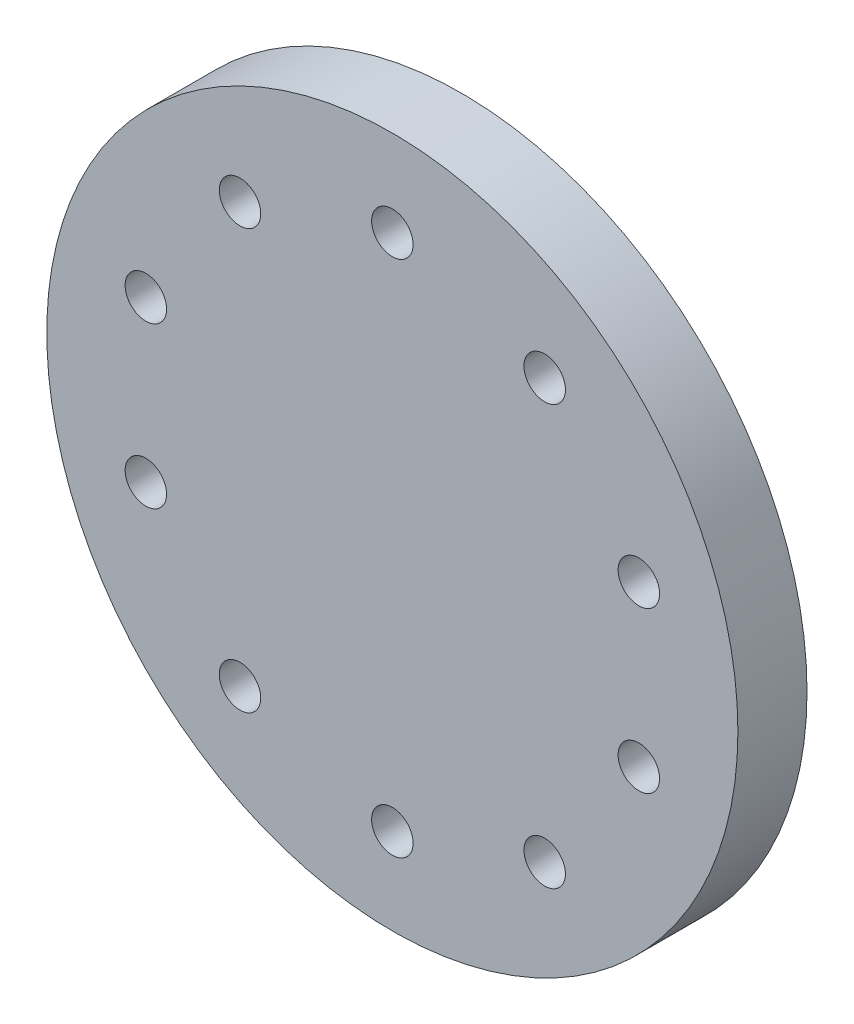
ISO-10303-21;
HEADER;
FILE_DESCRIPTION(('STEP AP214'),'2;1');
FILE_NAME('part.step','',(''),(''),'','','');
FILE_SCHEMA(('AUTOMOTIVE_DESIGN { 1 0 10303 214 1 1 1 1 }'));
ENDSEC;
DATA;
#1=APPLICATION_CONTEXT('core data for automotive mechanical design processes');
#2=APPLICATION_PROTOCOL_DEFINITION('international standard','automotive_design',2000,#1);
#3=PRODUCT_CONTEXT('',#1,'mechanical');
#4=PRODUCT('Part','Part','',(#3));
#5=PRODUCT_RELATED_PRODUCT_CATEGORY('part','',(#4));
#6=PRODUCT_DEFINITION_FORMATION('','',#4);
#7=PRODUCT_DEFINITION_CONTEXT('part definition',#1,'design');
#8=PRODUCT_DEFINITION('design','',#6,#7);
#9=PRODUCT_DEFINITION_SHAPE('','',#8);
#10=(LENGTH_UNIT() NAMED_UNIT(*) SI_UNIT(.MILLI.,.METRE.));
#11=(NAMED_UNIT(*) PLANE_ANGLE_UNIT() SI_UNIT($,.RADIAN.));
#12=(NAMED_UNIT(*) SI_UNIT($,.STERADIAN.) SOLID_ANGLE_UNIT());
#13=UNCERTAINTY_MEASURE_WITH_UNIT(LENGTH_MEASURE(1.E-05),#10,'distance_accuracy_value','');
#14=(GEOMETRIC_REPRESENTATION_CONTEXT(3) GLOBAL_UNCERTAINTY_ASSIGNED_CONTEXT((#13)) GLOBAL_UNIT_ASSIGNED_CONTEXT((#10,
#11,#12)) REPRESENTATION_CONTEXT('',''));
#15=CARTESIAN_POINT('',(0.,0.,0.));
#16=DIRECTION('',(0.,0.,1.));
#17=DIRECTION('',(1.,0.,0.));
#18=AXIS2_PLACEMENT_3D('',#15,#16,#17);
#19=CARTESIAN_POINT('',(0.,0.,2.));
#20=DIRECTION('',(0.,0.,1.));
#21=DIRECTION('',(1.,0.,0.));
#22=AXIS2_PLACEMENT_3D('',#19,#20,#21);
#23=PLANE('',#22);
#24=CARTESIAN_POINT('',(-7.13292387221344,2.3176274578118,2.));
#25=DIRECTION('',(0.,0.,1.));
#26=DIRECTION('',(1.,0.,0.));
#27=AXIS2_PLACEMENT_3D('',#24,#25,#26);
#28=CIRCLE('',#27,0.600000000000381);
#29=CARTESIAN_POINT('',(-6.53292387221306,2.3176274578118,2.));
#30=VERTEX_POINT('',#29);
#31=EDGE_CURVE('E94',#30,#30,#28,.T.);
#32=ORIENTED_EDGE('',*,*,#31,.F.);
#33=EDGE_LOOP('',(#32));
#34=FACE_BOUND('',#33,.T.);
#35=CARTESIAN_POINT('',(-4.40838939219298,-6.0676274578123,2.));
#36=DIRECTION('',(0.,0.,1.));
#37=DIRECTION('',(1.,0.,0.));
#38=AXIS2_PLACEMENT_3D('',#35,#36,#37);
#39=CIRCLE('',#38,0.600000000000669);
#40=CARTESIAN_POINT('',(-3.80838939219231,-6.0676274578123,2.));
#41=VERTEX_POINT('',#40);
#42=EDGE_CURVE('E82',#41,#41,#39,.T.);
#43=ORIENTED_EDGE('',*,*,#42,.F.);
#44=EDGE_LOOP('',(#43));
#45=FACE_BOUND('',#44,.T.);
#46=CARTESIAN_POINT('',(4.40838939219413,-6.06762745781192,2.));
#47=DIRECTION('',(0.,0.,1.));
#48=DIRECTION('',(1.,0.,0.));
#49=AXIS2_PLACEMENT_3D('',#46,#47,#48);
#50=CIRCLE('',#49,0.600000000000539);
#51=CARTESIAN_POINT('',(5.00838939219467,-6.06762745781192,2.));
#52=VERTEX_POINT('',#51);
#53=EDGE_CURVE('E70',#52,#52,#50,.T.);
#54=ORIENTED_EDGE('',*,*,#53,.F.);
#55=EDGE_LOOP('',(#54));
#56=FACE_BOUND('',#55,.T.);
#57=CARTESIAN_POINT('',(7.13292387221388,2.31762745781241,2.));
#58=DIRECTION('',(0.,0.,1.));
#59=DIRECTION('',(1.,0.,0.));
#60=AXIS2_PLACEMENT_3D('',#57,#58,#59);
#61=CIRCLE('',#60,0.600000000000143);
#62=CARTESIAN_POINT('',(7.73292387221402,2.31762745781241,2.));
#63=VERTEX_POINT('',#62);
#64=EDGE_CURVE('E58',#63,#63,#61,.T.);
#65=ORIENTED_EDGE('',*,*,#64,.F.);
#66=EDGE_LOOP('',(#65));
#67=FACE_BOUND('',#66,.T.);
#68=CARTESIAN_POINT('',(0.,7.50000000000001,2.));
#69=DIRECTION('',(0.,0.,1.));
#70=DIRECTION('',(1.,0.,0.));
#71=AXIS2_PLACEMENT_3D('',#68,#69,#70);
#72=CIRCLE('',#71,0.6);
#73=CARTESIAN_POINT('',(0.6,7.50000000000001,2.));
#74=VERTEX_POINT('',#73);
#75=EDGE_CURVE('E47',#74,#74,#72,.T.);
#76=ORIENTED_EDGE('',*,*,#75,.F.);
#77=EDGE_LOOP('',(#76));
#78=FACE_BOUND('',#77,.T.);
#79=CARTESIAN_POINT('',(0.,0.,2.));
#80=DIRECTION('',(0.,0.,1.));
#81=DIRECTION('',(1.,0.,0.));
#82=AXIS2_PLACEMENT_3D('',#79,#80,#81);
#83=CIRCLE('',#82,10.);
#84=CARTESIAN_POINT('',(10.,0.,2.));
#85=VERTEX_POINT('',#84);
#86=EDGE_CURVE('E38',#85,#85,#83,.T.);
#87=ORIENTED_EDGE('',*,*,#86,.T.);
#88=EDGE_LOOP('',(#87));
#89=FACE_BOUND('',#88,.T.);
#90=CARTESIAN_POINT('',(4.40838939219356,6.06762745781211,2.));
#91=DIRECTION('',(0.,0.,1.));
#92=DIRECTION('',(1.,0.,0.));
#93=AXIS2_PLACEMENT_3D('',#90,#91,#92);
#94=CIRCLE('',#93,0.600000000000001);
#95=CARTESIAN_POINT('',(5.00838939219356,6.06762745781211,2.));
#96=VERTEX_POINT('',#95);
#97=EDGE_CURVE('E52',#96,#96,#94,.T.);
#98=ORIENTED_EDGE('',*,*,#97,.F.);
#99=EDGE_LOOP('',(#98));
#100=FACE_BOUND('',#99,.T.);
#101=CARTESIAN_POINT('',(7.13292387221408,-2.3176274578118,2.));
#102=DIRECTION('',(0.,0.,1.));
#103=DIRECTION('',(1.,0.,0.));
#104=AXIS2_PLACEMENT_3D('',#101,#102,#103);
#105=CIRCLE('',#104,0.600000000000342);
#106=CARTESIAN_POINT('',(7.73292387221442,-2.3176274578118,2.));
#107=VERTEX_POINT('',#106);
#108=EDGE_CURVE('E64',#107,#107,#105,.T.);
#109=ORIENTED_EDGE('',*,*,#108,.F.);
#110=EDGE_LOOP('',(#109));
#111=FACE_BOUND('',#110,.T.);
#112=CARTESIAN_POINT('',(6.3765149198537E-13,-7.50000000000001,2.));
#113=DIRECTION('',(0.,0.,1.));
#114=DIRECTION('',(1.,0.,0.));
#115=AXIS2_PLACEMENT_3D('',#112,#113,#114);
#116=CIRCLE('',#115,0.60000000000066);
#117=CARTESIAN_POINT('',(0.600000000001297,-7.50000000000001,2.));
#118=VERTEX_POINT('',#117);
#119=EDGE_CURVE('E76',#118,#118,#116,.T.);
#120=ORIENTED_EDGE('',*,*,#119,.F.);
#121=EDGE_LOOP('',(#120));
#122=FACE_BOUND('',#121,.T.);
#123=CARTESIAN_POINT('',(-7.13292387221324,-2.31762745781241,2.));
#124=DIRECTION('',(0.,0.,1.));
#125=DIRECTION('',(1.,0.,0.));
#126=AXIS2_PLACEMENT_3D('',#123,#124,#125);
#127=CIRCLE('',#126,0.600000000000556);
#128=CARTESIAN_POINT('',(-6.53292387221269,-2.31762745781241,2.));
#129=VERTEX_POINT('',#128);
#130=EDGE_CURVE('E88',#129,#129,#127,.T.);
#131=ORIENTED_EDGE('',*,*,#130,.F.);
#132=EDGE_LOOP('',(#131));
#133=FACE_BOUND('',#132,.T.);
#134=CARTESIAN_POINT('',(-4.40838939219349,6.06762745781192,2.));
#135=DIRECTION('',(0.,0.,1.));
#136=DIRECTION('',(1.,0.,0.));
#137=AXIS2_PLACEMENT_3D('',#134,#135,#136);
#138=CIRCLE('',#137,0.600000000000209);
#139=CARTESIAN_POINT('',(-3.80838939219329,6.06762745781192,2.));
#140=VERTEX_POINT('',#139);
#141=EDGE_CURVE('E100',#140,#140,#138,.T.);
#142=ORIENTED_EDGE('',*,*,#141,.F.);
#143=EDGE_LOOP('',(#142));
#144=FACE_BOUND('',#143,.T.);
#145=ADVANCED_FACE('F31',(#34,#45,#56,#67,#78,#89,#100,#111,#122,#133,#144),#23,.T.);
#146=CARTESIAN_POINT('',(0.,0.,0.));
#147=DIRECTION('',(0.,0.,1.));
#148=DIRECTION('',(1.,0.,0.));
#149=AXIS2_PLACEMENT_3D('',#146,#147,#148);
#150=PLANE('',#149);
#151=CARTESIAN_POINT('',(0.,0.,0.));
#152=DIRECTION('',(0.,0.,1.));
#153=DIRECTION('',(1.,0.,0.));
#154=AXIS2_PLACEMENT_3D('',#151,#152,#153);
#155=CIRCLE('',#154,1.5);
#156=CARTESIAN_POINT('',(1.5,0.,0.));
#157=VERTEX_POINT('',#156);
#158=EDGE_CURVE('E10',#157,#157,#155,.F.);
#159=ORIENTED_EDGE('',*,*,#158,.F.);
#160=EDGE_LOOP('',(#159));
#161=FACE_BOUND('',#160,.T.);
#162=CARTESIAN_POINT('',(0.,0.,0.));
#163=DIRECTION('',(0.,0.,1.));
#164=DIRECTION('',(1.,0.,0.));
#165=AXIS2_PLACEMENT_3D('',#162,#163,#164);
#166=CIRCLE('',#165,10.);
#167=CARTESIAN_POINT('',(10.,0.,0.));
#168=VERTEX_POINT('',#167);
#169=EDGE_CURVE('E42',#168,#168,#166,.T.);
#170=ORIENTED_EDGE('',*,*,#169,.F.);
#171=EDGE_LOOP('',(#170));
#172=FACE_BOUND('',#171,.T.);
#173=CARTESIAN_POINT('',(0.,7.50000000000001,0.));
#174=DIRECTION('',(0.,0.,1.));
#175=DIRECTION('',(1.,0.,0.));
#176=AXIS2_PLACEMENT_3D('',#173,#174,#175);
#177=CIRCLE('',#176,0.6);
#178=CARTESIAN_POINT('',(0.6,7.50000000000001,0.));
#179=VERTEX_POINT('',#178);
#180=EDGE_CURVE('E49',#179,#179,#177,.T.);
#181=ORIENTED_EDGE('',*,*,#180,.T.);
#182=EDGE_LOOP('',(#181));
#183=FACE_BOUND('',#182,.T.);
#184=CARTESIAN_POINT('',(4.40838939219356,6.06762745781211,0.));
#185=DIRECTION('',(0.,0.,1.));
#186=DIRECTION('',(1.,0.,0.));
#187=AXIS2_PLACEMENT_3D('',#184,#185,#186);
#188=CIRCLE('',#187,0.600000000000001);
#189=CARTESIAN_POINT('',(5.00838939219356,6.06762745781211,0.));
#190=VERTEX_POINT('',#189);
#191=EDGE_CURVE('E55',#190,#190,#188,.T.);
#192=ORIENTED_EDGE('',*,*,#191,.T.);
#193=EDGE_LOOP('',(#192));
#194=FACE_BOUND('',#193,.T.);
#195=CARTESIAN_POINT('',(7.13292387221388,2.31762745781241,0.));
#196=DIRECTION('',(0.,0.,1.));
#197=DIRECTION('',(1.,0.,0.));
#198=AXIS2_PLACEMENT_3D('',#195,#196,#197);
#199=CIRCLE('',#198,0.600000000000143);
#200=CARTESIAN_POINT('',(7.73292387221402,2.31762745781241,0.));
#201=VERTEX_POINT('',#200);
#202=EDGE_CURVE('E61',#201,#201,#199,.T.);
#203=ORIENTED_EDGE('',*,*,#202,.T.);
#204=EDGE_LOOP('',(#203));
#205=FACE_BOUND('',#204,.T.);
#206=CARTESIAN_POINT('',(7.13292387221408,-2.3176274578118,0.));
#207=DIRECTION('',(0.,0.,1.));
#208=DIRECTION('',(1.,0.,0.));
#209=AXIS2_PLACEMENT_3D('',#206,#207,#208);
#210=CIRCLE('',#209,0.600000000000342);
#211=CARTESIAN_POINT('',(7.73292387221442,-2.3176274578118,0.));
#212=VERTEX_POINT('',#211);
#213=EDGE_CURVE('E67',#212,#212,#210,.T.);
#214=ORIENTED_EDGE('',*,*,#213,.T.);
#215=EDGE_LOOP('',(#214));
#216=FACE_BOUND('',#215,.T.);
#217=CARTESIAN_POINT('',(4.40838939219413,-6.06762745781192,0.));
#218=DIRECTION('',(0.,0.,1.));
#219=DIRECTION('',(1.,0.,0.));
#220=AXIS2_PLACEMENT_3D('',#217,#218,#219);
#221=CIRCLE('',#220,0.600000000000539);
#222=CARTESIAN_POINT('',(5.00838939219467,-6.06762745781192,0.));
#223=VERTEX_POINT('',#222);
#224=EDGE_CURVE('E73',#223,#223,#221,.T.);
#225=ORIENTED_EDGE('',*,*,#224,.T.);
#226=EDGE_LOOP('',(#225));
#227=FACE_BOUND('',#226,.T.);
#228=CARTESIAN_POINT('',(6.3765149198537E-13,-7.50000000000001,0.));
#229=DIRECTION('',(0.,0.,1.));
#230=DIRECTION('',(1.,0.,0.));
#231=AXIS2_PLACEMENT_3D('',#228,#229,#230);
#232=CIRCLE('',#231,0.60000000000066);
#233=CARTESIAN_POINT('',(0.600000000001297,-7.50000000000001,0.));
#234=VERTEX_POINT('',#233);
#235=EDGE_CURVE('E79',#234,#234,#232,.T.);
#236=ORIENTED_EDGE('',*,*,#235,.T.);
#237=EDGE_LOOP('',(#236));
#238=FACE_BOUND('',#237,.T.);
#239=CARTESIAN_POINT('',(-4.40838939219298,-6.0676274578123,0.));
#240=DIRECTION('',(0.,0.,1.));
#241=DIRECTION('',(1.,0.,0.));
#242=AXIS2_PLACEMENT_3D('',#239,#240,#241);
#243=CIRCLE('',#242,0.600000000000669);
#244=CARTESIAN_POINT('',(-3.80838939219231,-6.0676274578123,0.));
#245=VERTEX_POINT('',#244);
#246=EDGE_CURVE('E85',#245,#245,#243,.T.);
#247=ORIENTED_EDGE('',*,*,#246,.T.);
#248=EDGE_LOOP('',(#247));
#249=FACE_BOUND('',#248,.T.);
#250=CARTESIAN_POINT('',(-7.13292387221324,-2.31762745781241,0.));
#251=DIRECTION('',(0.,0.,1.));
#252=DIRECTION('',(1.,0.,0.));
#253=AXIS2_PLACEMENT_3D('',#250,#251,#252);
#254=CIRCLE('',#253,0.600000000000556);
#255=CARTESIAN_POINT('',(-6.53292387221269,-2.31762745781241,0.));
#256=VERTEX_POINT('',#255);
#257=EDGE_CURVE('E91',#256,#256,#254,.T.);
#258=ORIENTED_EDGE('',*,*,#257,.T.);
#259=EDGE_LOOP('',(#258));
#260=FACE_BOUND('',#259,.T.);
#261=CARTESIAN_POINT('',(-7.13292387221344,2.3176274578118,0.));
#262=DIRECTION('',(0.,0.,1.));
#263=DIRECTION('',(1.,0.,0.));
#264=AXIS2_PLACEMENT_3D('',#261,#262,#263);
#265=CIRCLE('',#264,0.600000000000381);
#266=CARTESIAN_POINT('',(-6.53292387221306,2.3176274578118,0.));
#267=VERTEX_POINT('',#266);
#268=EDGE_CURVE('E97',#267,#267,#265,.T.);
#269=ORIENTED_EDGE('',*,*,#268,.T.);
#270=EDGE_LOOP('',(#269));
#271=FACE_BOUND('',#270,.T.);
#272=CARTESIAN_POINT('',(-4.40838939219349,6.06762745781192,0.));
#273=DIRECTION('',(0.,0.,1.));
#274=DIRECTION('',(1.,0.,0.));
#275=AXIS2_PLACEMENT_3D('',#272,#273,#274);
#276=CIRCLE('',#275,0.600000000000209);
#277=CARTESIAN_POINT('',(-3.80838939219329,6.06762745781192,0.));
#278=VERTEX_POINT('',#277);
#279=EDGE_CURVE('E103',#278,#278,#276,.T.);
#280=ORIENTED_EDGE('',*,*,#279,.T.);
#281=EDGE_LOOP('',(#280));
#282=FACE_BOUND('',#281,.T.);
#283=ADVANCED_FACE('F127',(#161,#172,#183,#194,#205,#216,#227,#238,#249,#260,#271,#282),#150,.F.);
#284=CARTESIAN_POINT('',(0.,0.,2.));
#285=DIRECTION('',(0.,0.,-1.));
#286=DIRECTION('',(-1.,0.,0.));
#287=AXIS2_PLACEMENT_3D('',#284,#285,#286);
#288=CYLINDRICAL_SURFACE('',#287,10.);
#289=ORIENTED_EDGE('',*,*,#86,.F.);
#290=EDGE_LOOP('',(#289));
#291=FACE_BOUND('',#290,.T.);
#292=ORIENTED_EDGE('',*,*,#169,.T.);
#293=EDGE_LOOP('',(#292));
#294=FACE_BOUND('',#293,.T.);
#295=ADVANCED_FACE('F33',(#291,#294),#288,.T.);
#296=CARTESIAN_POINT('',(0.,7.50000000000001,2.));
#297=DIRECTION('',(0.,0.,-1.));
#298=DIRECTION('',(-1.,0.,0.));
#299=AXIS2_PLACEMENT_3D('',#296,#297,#298);
#300=CYLINDRICAL_SURFACE('',#299,0.6);
#301=ORIENTED_EDGE('',*,*,#75,.T.);
#302=EDGE_LOOP('',(#301));
#303=FACE_BOUND('',#302,.T.);
#304=ORIENTED_EDGE('',*,*,#180,.F.);
#305=EDGE_LOOP('',(#304));
#306=FACE_BOUND('',#305,.T.);
#307=ADVANCED_FACE('F137',(#303,#306),#300,.F.);
#308=CARTESIAN_POINT('',(4.40838939219356,6.06762745781211,2.));
#309=DIRECTION('',(0.,0.,-1.));
#310=DIRECTION('',(-1.,0.,0.));
#311=AXIS2_PLACEMENT_3D('',#308,#309,#310);
#312=CYLINDRICAL_SURFACE('',#311,0.600000000000001);
#313=ORIENTED_EDGE('',*,*,#97,.T.);
#314=EDGE_LOOP('',(#313));
#315=FACE_BOUND('',#314,.T.);
#316=ORIENTED_EDGE('',*,*,#191,.F.);
#317=EDGE_LOOP('',(#316));
#318=FACE_BOUND('',#317,.T.);
#319=ADVANCED_FACE('F140',(#315,#318),#312,.F.);
#320=CARTESIAN_POINT('',(7.13292387221388,2.31762745781241,2.));
#321=DIRECTION('',(0.,0.,-1.));
#322=DIRECTION('',(-1.,0.,0.));
#323=AXIS2_PLACEMENT_3D('',#320,#321,#322);
#324=CYLINDRICAL_SURFACE('',#323,0.600000000000143);
#325=ORIENTED_EDGE('',*,*,#64,.T.);
#326=EDGE_LOOP('',(#325));
#327=FACE_BOUND('',#326,.T.);
#328=ORIENTED_EDGE('',*,*,#202,.F.);
#329=EDGE_LOOP('',(#328));
#330=FACE_BOUND('',#329,.T.);
#331=ADVANCED_FACE('F144',(#327,#330),#324,.F.);
#332=CARTESIAN_POINT('',(7.13292387221408,-2.3176274578118,2.));
#333=DIRECTION('',(0.,0.,-1.));
#334=DIRECTION('',(-1.,0.,0.));
#335=AXIS2_PLACEMENT_3D('',#332,#333,#334);
#336=CYLINDRICAL_SURFACE('',#335,0.600000000000342);
#337=ORIENTED_EDGE('',*,*,#108,.T.);
#338=EDGE_LOOP('',(#337));
#339=FACE_BOUND('',#338,.T.);
#340=ORIENTED_EDGE('',*,*,#213,.F.);
#341=EDGE_LOOP('',(#340));
#342=FACE_BOUND('',#341,.T.);
#343=ADVANCED_FACE('F148',(#339,#342),#336,.F.);
#344=CARTESIAN_POINT('',(4.40838939219413,-6.06762745781192,2.));
#345=DIRECTION('',(0.,0.,-1.));
#346=DIRECTION('',(-1.,0.,0.));
#347=AXIS2_PLACEMENT_3D('',#344,#345,#346);
#348=CYLINDRICAL_SURFACE('',#347,0.600000000000539);
#349=ORIENTED_EDGE('',*,*,#53,.T.);
#350=EDGE_LOOP('',(#349));
#351=FACE_BOUND('',#350,.T.);
#352=ORIENTED_EDGE('',*,*,#224,.F.);
#353=EDGE_LOOP('',(#352));
#354=FACE_BOUND('',#353,.T.);
#355=ADVANCED_FACE('F152',(#351,#354),#348,.F.);
#356=CARTESIAN_POINT('',(6.3765149198537E-13,-7.50000000000001,2.));
#357=DIRECTION('',(0.,0.,-1.));
#358=DIRECTION('',(-1.,0.,0.));
#359=AXIS2_PLACEMENT_3D('',#356,#357,#358);
#360=CYLINDRICAL_SURFACE('',#359,0.60000000000066);
#361=ORIENTED_EDGE('',*,*,#119,.T.);
#362=EDGE_LOOP('',(#361));
#363=FACE_BOUND('',#362,.T.);
#364=ORIENTED_EDGE('',*,*,#235,.F.);
#365=EDGE_LOOP('',(#364));
#366=FACE_BOUND('',#365,.T.);
#367=ADVANCED_FACE('F156',(#363,#366),#360,.F.);
#368=CARTESIAN_POINT('',(-4.40838939219298,-6.0676274578123,2.));
#369=DIRECTION('',(0.,0.,-1.));
#370=DIRECTION('',(-1.,0.,0.));
#371=AXIS2_PLACEMENT_3D('',#368,#369,#370);
#372=CYLINDRICAL_SURFACE('',#371,0.600000000000669);
#373=ORIENTED_EDGE('',*,*,#42,.T.);
#374=EDGE_LOOP('',(#373));
#375=FACE_BOUND('',#374,.T.);
#376=ORIENTED_EDGE('',*,*,#246,.F.);
#377=EDGE_LOOP('',(#376));
#378=FACE_BOUND('',#377,.T.);
#379=ADVANCED_FACE('F160',(#375,#378),#372,.F.);
#380=CARTESIAN_POINT('',(-7.13292387221324,-2.31762745781241,2.));
#381=DIRECTION('',(0.,0.,-1.));
#382=DIRECTION('',(-1.,0.,0.));
#383=AXIS2_PLACEMENT_3D('',#380,#381,#382);
#384=CYLINDRICAL_SURFACE('',#383,0.600000000000556);
#385=ORIENTED_EDGE('',*,*,#130,.T.);
#386=EDGE_LOOP('',(#385));
#387=FACE_BOUND('',#386,.T.);
#388=ORIENTED_EDGE('',*,*,#257,.F.);
#389=EDGE_LOOP('',(#388));
#390=FACE_BOUND('',#389,.T.);
#391=ADVANCED_FACE('F164',(#387,#390),#384,.F.);
#392=CARTESIAN_POINT('',(-7.13292387221344,2.3176274578118,2.));
#393=DIRECTION('',(0.,0.,-1.));
#394=DIRECTION('',(-1.,0.,0.));
#395=AXIS2_PLACEMENT_3D('',#392,#393,#394);
#396=CYLINDRICAL_SURFACE('',#395,0.600000000000381);
#397=ORIENTED_EDGE('',*,*,#31,.T.);
#398=EDGE_LOOP('',(#397));
#399=FACE_BOUND('',#398,.T.);
#400=ORIENTED_EDGE('',*,*,#268,.F.);
#401=EDGE_LOOP('',(#400));
#402=FACE_BOUND('',#401,.T.);
#403=ADVANCED_FACE('F123',(#399,#402),#396,.F.);
#404=CARTESIAN_POINT('',(-4.40838939219349,6.06762745781192,2.));
#405=DIRECTION('',(0.,0.,-1.));
#406=DIRECTION('',(-1.,0.,0.));
#407=AXIS2_PLACEMENT_3D('',#404,#405,#406);
#408=CYLINDRICAL_SURFACE('',#407,0.600000000000209);
#409=ORIENTED_EDGE('',*,*,#141,.T.);
#410=EDGE_LOOP('',(#409));
#411=FACE_BOUND('',#410,.T.);
#412=ORIENTED_EDGE('',*,*,#279,.F.);
#413=EDGE_LOOP('',(#412));
#414=FACE_BOUND('',#413,.T.);
#415=ADVANCED_FACE('F116',(#411,#414),#408,.F.);
#416=CARTESIAN_POINT('',(0.,0.,-3.));
#417=DIRECTION('',(0.,0.,1.));
#418=DIRECTION('',(1.,0.,0.));
#419=AXIS2_PLACEMENT_3D('',#416,#417,#418);
#420=CYLINDRICAL_SURFACE('',#419,1.5);
#421=CARTESIAN_POINT('',(0.,0.,-3.));
#422=DIRECTION('',(0.,0.,-1.));
#423=DIRECTION('',(-1.,0.,0.));
#424=AXIS2_PLACEMENT_3D('',#421,#422,#423);
#425=CIRCLE('',#424,1.5);
#426=CARTESIAN_POINT('',(-1.5,0.,-3.));
#427=VERTEX_POINT('',#426);
#428=EDGE_CURVE('E106',#427,#427,#425,.T.);
#429=ORIENTED_EDGE('',*,*,#428,.F.);
#430=EDGE_LOOP('',(#429));
#431=FACE_BOUND('',#430,.T.);
#432=ORIENTED_EDGE('',*,*,#158,.T.);
#433=EDGE_LOOP('',(#432));
#434=FACE_BOUND('',#433,.T.);
#435=ADVANCED_FACE('F114',(#431,#434),#420,.T.);
#436=CARTESIAN_POINT('',(0.,0.,-3.));
#437=DIRECTION('',(0.,0.,-1.));
#438=DIRECTION('',(-1.,0.,0.));
#439=AXIS2_PLACEMENT_3D('',#436,#437,#438);
#440=PLANE('',#439);
#441=ORIENTED_EDGE('',*,*,#428,.T.);
#442=EDGE_LOOP('',(#441));
#443=FACE_BOUND('',#442,.T.);
#444=ADVANCED_FACE('F112',(#443),#440,.T.);
#445=CLOSED_SHELL('',(#145,#283,#295,#307,#319,#331,#343,#355,#367,#379,#391,#403,#415,#435,#444));
#446=MANIFOLD_SOLID_BREP('B2',#445);
#447=ADVANCED_BREP_SHAPE_REPRESENTATION('',(#18,#446),#14);
#448=SHAPE_DEFINITION_REPRESENTATION(#9,#447);
ENDSEC;
END-ISO-10303-21;
